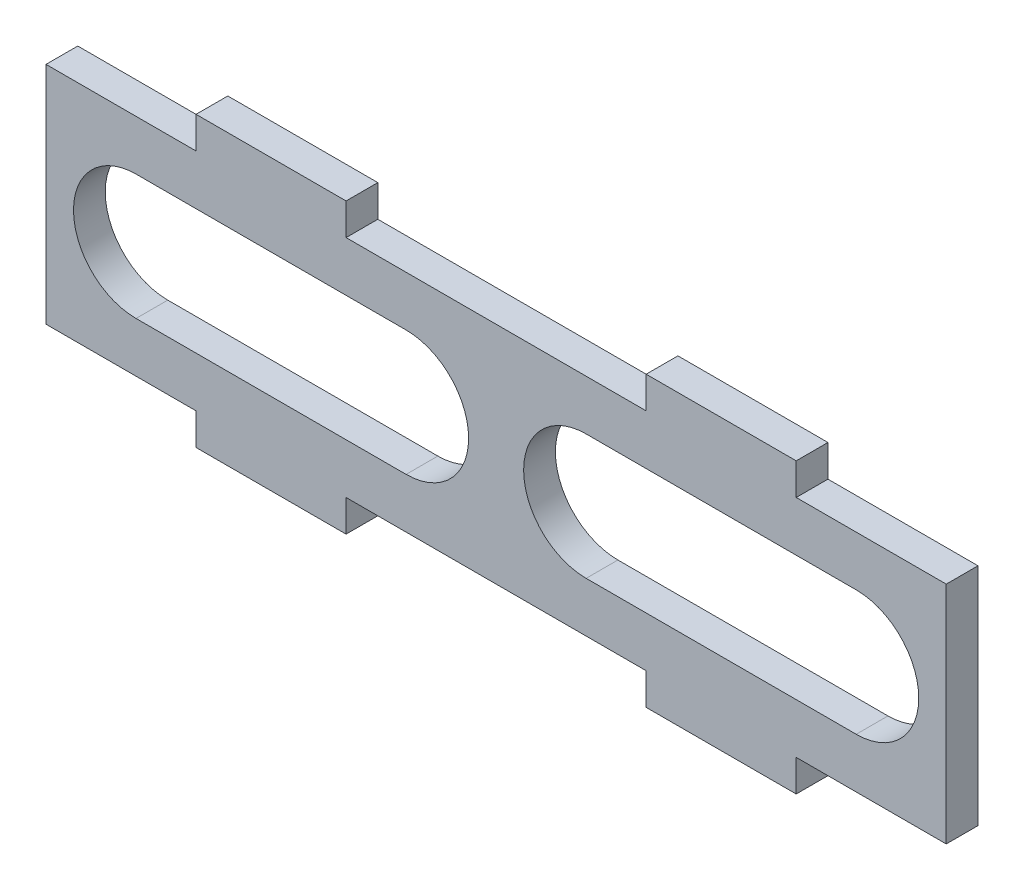
ISO-10303-21;
HEADER;
FILE_DESCRIPTION(('STEP AP214'),'2;1');
FILE_NAME('part.step','',(''),(''),'','','');
FILE_SCHEMA(('AUTOMOTIVE_DESIGN { 1 0 10303 214 1 1 1 1 }'));
ENDSEC;
DATA;
#1=APPLICATION_CONTEXT('core data for automotive mechanical design processes');
#2=APPLICATION_PROTOCOL_DEFINITION('international standard','automotive_design',2000,#1);
#3=PRODUCT_CONTEXT('',#1,'mechanical');
#4=PRODUCT('Part','Part','',(#3));
#5=PRODUCT_RELATED_PRODUCT_CATEGORY('part','',(#4));
#6=PRODUCT_DEFINITION_FORMATION('','',#4);
#7=PRODUCT_DEFINITION_CONTEXT('part definition',#1,'design');
#8=PRODUCT_DEFINITION('design','',#6,#7);
#9=PRODUCT_DEFINITION_SHAPE('','',#8);
#10=(LENGTH_UNIT() NAMED_UNIT(*) SI_UNIT(.MILLI.,.METRE.));
#11=(NAMED_UNIT(*) PLANE_ANGLE_UNIT() SI_UNIT($,.RADIAN.));
#12=(NAMED_UNIT(*) SI_UNIT($,.STERADIAN.) SOLID_ANGLE_UNIT());
#13=UNCERTAINTY_MEASURE_WITH_UNIT(LENGTH_MEASURE(1.E-05),#10,'distance_accuracy_value','');
#14=(GEOMETRIC_REPRESENTATION_CONTEXT(3) GLOBAL_UNCERTAINTY_ASSIGNED_CONTEXT((#13)) GLOBAL_UNIT_ASSIGNED_CONTEXT((#10,
#11,#12)) REPRESENTATION_CONTEXT('',''));
#15=CARTESIAN_POINT('',(0.,0.,0.));
#16=DIRECTION('',(0.,0.,1.));
#17=DIRECTION('',(1.,0.,0.));
#18=AXIS2_PLACEMENT_3D('',#15,#16,#17);
#19=CARTESIAN_POINT('',(-90.,45.,6.35));
#20=DIRECTION('',(0.,-1.,0.));
#21=DIRECTION('',(0.,0.,-1.));
#22=AXIS2_PLACEMENT_3D('',#19,#20,#21);
#23=PLANE('',#22);
#24=DIRECTION('',(-1.,0.,0.));
#25=VECTOR('',#24,1.);
#26=CARTESIAN_POINT('',(-90.,45.,6.35));
#27=LINE('',#26,#25);
#28=CARTESIAN_POINT('',(29.9999999999999,45.,6.35));
#29=VERTEX_POINT('',#28);
#30=CARTESIAN_POINT('',(-30.,45.,6.35));
#31=VERTEX_POINT('',#30);
#32=EDGE_CURVE('E48',#29,#31,#27,.T.);
#33=ORIENTED_EDGE('',*,*,#32,.F.);
#34=DIRECTION('',(0.,0.,1.));
#35=VECTOR('',#34,1.);
#36=CARTESIAN_POINT('',(29.9999999999999,45.,-30.6646783775731));
#37=LINE('',#36,#35);
#38=CARTESIAN_POINT('',(29.9999999999999,45.,0.));
#39=VERTEX_POINT('',#38);
#40=EDGE_CURVE('E230',#39,#29,#37,.T.);
#41=ORIENTED_EDGE('',*,*,#40,.F.);
#42=DIRECTION('',(-1.,0.,0.));
#43=VECTOR('',#42,1.);
#44=CARTESIAN_POINT('',(-90.,45.,0.));
#45=LINE('',#44,#43);
#46=CARTESIAN_POINT('',(-30.,45.,0.));
#47=VERTEX_POINT('',#46);
#48=EDGE_CURVE('E228',#39,#47,#45,.T.);
#49=ORIENTED_EDGE('',*,*,#48,.T.);
#50=DIRECTION('',(0.,0.,1.));
#51=VECTOR('',#50,1.);
#52=CARTESIAN_POINT('',(-30.,45.,-30.6646783775731));
#53=LINE('',#52,#51);
#54=EDGE_CURVE('E313',#47,#31,#53,.T.);
#55=ORIENTED_EDGE('',*,*,#54,.T.);
#56=EDGE_LOOP('',(#33,#41,#49,#55));
#57=FACE_BOUND('',#56,.T.);
#58=ADVANCED_FACE('F33',(#57),#23,.F.);
#59=CARTESIAN_POINT('',(-90.,0.,6.35));
#60=DIRECTION('',(0.,1.,0.));
#61=DIRECTION('',(0.,0.,1.));
#62=AXIS2_PLACEMENT_3D('',#59,#60,#61);
#63=PLANE('',#62);
#64=DIRECTION('',(1.,0.,0.));
#65=VECTOR('',#64,1.);
#66=CARTESIAN_POINT('',(-90.,0.,0.));
#67=LINE('',#66,#65);
#68=CARTESIAN_POINT('',(-30.,0.,0.));
#69=VERTEX_POINT('',#68);
#70=CARTESIAN_POINT('',(29.9999999999999,0.,0.));
#71=VERTEX_POINT('',#70);
#72=EDGE_CURVE('E421',#69,#71,#67,.T.);
#73=ORIENTED_EDGE('',*,*,#72,.T.);
#74=DIRECTION('',(0.,0.,1.));
#75=VECTOR('',#74,1.);
#76=CARTESIAN_POINT('',(30.,0.,-30.6646783775731));
#77=LINE('',#76,#75);
#78=CARTESIAN_POINT('',(29.9999999999999,0.,6.35));
#79=VERTEX_POINT('',#78);
#80=EDGE_CURVE('E279',#71,#79,#77,.T.);
#81=ORIENTED_EDGE('',*,*,#80,.T.);
#82=DIRECTION('',(1.,0.,0.));
#83=VECTOR('',#82,1.);
#84=CARTESIAN_POINT('',(-90.,0.,6.35));
#85=LINE('',#84,#83);
#86=CARTESIAN_POINT('',(-30.,0.,6.35));
#87=VERTEX_POINT('',#86);
#88=EDGE_CURVE('E408',#87,#79,#85,.T.);
#89=ORIENTED_EDGE('',*,*,#88,.F.);
#90=DIRECTION('',(0.,0.,1.));
#91=VECTOR('',#90,1.);
#92=CARTESIAN_POINT('',(-30.,0.,-30.6646783775731));
#93=LINE('',#92,#91);
#94=EDGE_CURVE('E303',#69,#87,#93,.T.);
#95=ORIENTED_EDGE('',*,*,#94,.F.);
#96=EDGE_LOOP('',(#73,#81,#89,#95));
#97=FACE_BOUND('',#96,.T.);
#98=ADVANCED_FACE('F483',(#97),#63,.F.);
#99=CARTESIAN_POINT('',(59.9999999999999,0.,6.35));
#100=VERTEX_POINT('',#99);
#101=CARTESIAN_POINT('',(90.,0.,6.35));
#102=VERTEX_POINT('',#101);
#103=EDGE_CURVE('E402',#100,#102,#85,.T.);
#104=ORIENTED_EDGE('',*,*,#103,.F.);
#105=DIRECTION('',(0.,0.,1.));
#106=VECTOR('',#105,1.);
#107=CARTESIAN_POINT('',(60.,0.,-30.6646783775731));
#108=LINE('',#107,#106);
#109=CARTESIAN_POINT('',(60.,0.,0.));
#110=VERTEX_POINT('',#109);
#111=EDGE_CURVE('E272',#110,#100,#108,.T.);
#112=ORIENTED_EDGE('',*,*,#111,.F.);
#113=CARTESIAN_POINT('',(90.,0.,0.));
#114=VERTEX_POINT('',#113);
#115=EDGE_CURVE('E416',#110,#114,#67,.T.);
#116=ORIENTED_EDGE('',*,*,#115,.T.);
#117=DIRECTION('',(0.,0.,-1.));
#118=VECTOR('',#117,1.);
#119=CARTESIAN_POINT('',(90.,0.,6.35));
#120=LINE('',#119,#118);
#121=EDGE_CURVE('E41',#102,#114,#120,.T.);
#122=ORIENTED_EDGE('',*,*,#121,.F.);
#123=EDGE_LOOP('',(#104,#112,#116,#122));
#124=FACE_BOUND('',#123,.T.);
#125=ADVANCED_FACE('F487',(#124),#63,.F.);
#126=DIRECTION('',(0.,0.,1.));
#127=VECTOR('',#126,1.);
#128=CARTESIAN_POINT('',(-60.,45.,-30.6646783775731));
#129=LINE('',#128,#127);
#130=CARTESIAN_POINT('',(-60.,45.,0.));
#131=VERTEX_POINT('',#130);
#132=CARTESIAN_POINT('',(-60.,45.,6.35));
#133=VERTEX_POINT('',#132);
#134=EDGE_CURVE('E321',#131,#133,#129,.T.);
#135=ORIENTED_EDGE('',*,*,#134,.F.);
#136=CARTESIAN_POINT('',(-90.,45.,0.));
#137=VERTEX_POINT('',#136);
#138=EDGE_CURVE('E423',#131,#137,#45,.T.);
#139=ORIENTED_EDGE('',*,*,#138,.T.);
#140=DIRECTION('',(0.,0.,-1.));
#141=VECTOR('',#140,1.);
#142=CARTESIAN_POINT('',(-90.,45.,6.35));
#143=LINE('',#142,#141);
#144=CARTESIAN_POINT('',(-90.,45.,6.35));
#145=VERTEX_POINT('',#144);
#146=EDGE_CURVE('E413',#145,#137,#143,.T.);
#147=ORIENTED_EDGE('',*,*,#146,.F.);
#148=EDGE_CURVE('E410',#133,#145,#27,.T.);
#149=ORIENTED_EDGE('',*,*,#148,.F.);
#150=EDGE_LOOP('',(#135,#139,#147,#149));
#151=FACE_BOUND('',#150,.T.);
#152=ADVANCED_FACE('F462',(#151),#23,.F.);
#153=CARTESIAN_POINT('',(-90.,0.,6.35));
#154=DIRECTION('',(1.,0.,0.));
#155=DIRECTION('',(0.,0.,-1.));
#156=AXIS2_PLACEMENT_3D('',#153,#154,#155);
#157=PLANE('',#156);
#158=DIRECTION('',(0.,-1.,0.));
#159=VECTOR('',#158,1.);
#160=CARTESIAN_POINT('',(-90.,0.,0.));
#161=LINE('',#160,#159);
#162=CARTESIAN_POINT('',(-90.,0.,0.));
#163=VERTEX_POINT('',#162);
#164=EDGE_CURVE('E368',#137,#163,#161,.T.);
#165=ORIENTED_EDGE('',*,*,#164,.T.);
#166=DIRECTION('',(0.,0.,-1.));
#167=VECTOR('',#166,1.);
#168=CARTESIAN_POINT('',(-90.,0.,6.35));
#169=LINE('',#168,#167);
#170=CARTESIAN_POINT('',(-90.,0.,6.35));
#171=VERTEX_POINT('',#170);
#172=EDGE_CURVE('E11',#171,#163,#169,.T.);
#173=ORIENTED_EDGE('',*,*,#172,.F.);
#174=DIRECTION('',(0.,-1.,0.));
#175=VECTOR('',#174,1.);
#176=CARTESIAN_POINT('',(-90.,0.,6.35));
#177=LINE('',#176,#175);
#178=EDGE_CURVE('E399',#145,#171,#177,.T.);
#179=ORIENTED_EDGE('',*,*,#178,.F.);
#180=ORIENTED_EDGE('',*,*,#146,.T.);
#181=EDGE_LOOP('',(#165,#173,#179,#180));
#182=FACE_BOUND('',#181,.T.);
#183=ADVANCED_FACE('F35',(#182),#157,.F.);
#184=CARTESIAN_POINT('',(-60.,0.,0.));
#185=VERTEX_POINT('',#184);
#186=EDGE_CURVE('E417',#163,#185,#67,.T.);
#187=ORIENTED_EDGE('',*,*,#186,.T.);
#188=DIRECTION('',(0.,0.,1.));
#189=VECTOR('',#188,1.);
#190=CARTESIAN_POINT('',(-60.,0.,-30.6646783775731));
#191=LINE('',#190,#189);
#192=CARTESIAN_POINT('',(-60.,0.,6.35));
#193=VERTEX_POINT('',#192);
#194=EDGE_CURVE('E300',#185,#193,#191,.T.);
#195=ORIENTED_EDGE('',*,*,#194,.T.);
#196=EDGE_CURVE('E404',#171,#193,#85,.T.);
#197=ORIENTED_EDGE('',*,*,#196,.F.);
#198=ORIENTED_EDGE('',*,*,#172,.T.);
#199=EDGE_LOOP('',(#187,#195,#197,#198));
#200=FACE_BOUND('',#199,.T.);
#201=ADVANCED_FACE('F467',(#200),#63,.F.);
#202=CARTESIAN_POINT('',(90.,0.,6.35));
#203=DIRECTION('',(-1.,0.,0.));
#204=DIRECTION('',(0.,0.,1.));
#205=AXIS2_PLACEMENT_3D('',#202,#203,#204);
#206=PLANE('',#205);
#207=DIRECTION('',(0.,1.,0.));
#208=VECTOR('',#207,1.);
#209=CARTESIAN_POINT('',(90.,0.,0.));
#210=LINE('',#209,#208);
#211=CARTESIAN_POINT('',(90.,45.,0.));
#212=VERTEX_POINT('',#211);
#213=EDGE_CURVE('E420',#114,#212,#210,.T.);
#214=ORIENTED_EDGE('',*,*,#213,.T.);
#215=DIRECTION('',(0.,0.,-1.));
#216=VECTOR('',#215,1.);
#217=CARTESIAN_POINT('',(90.,45.,6.35));
#218=LINE('',#217,#216);
#219=CARTESIAN_POINT('',(90.,45.,6.35));
#220=VERTEX_POINT('',#219);
#221=EDGE_CURVE('E427',#220,#212,#218,.T.);
#222=ORIENTED_EDGE('',*,*,#221,.F.);
#223=DIRECTION('',(0.,1.,0.));
#224=VECTOR('',#223,1.);
#225=CARTESIAN_POINT('',(90.,0.,6.35));
#226=LINE('',#225,#224);
#227=EDGE_CURVE('E407',#102,#220,#226,.T.);
#228=ORIENTED_EDGE('',*,*,#227,.F.);
#229=ORIENTED_EDGE('',*,*,#121,.T.);
#230=EDGE_LOOP('',(#214,#222,#228,#229));
#231=FACE_BOUND('',#230,.T.);
#232=ADVANCED_FACE('F434',(#231),#206,.F.);
#233=CARTESIAN_POINT('',(59.9999999999999,45.,0.));
#234=VERTEX_POINT('',#233);
#235=EDGE_CURVE('E403',#212,#234,#45,.T.);
#236=ORIENTED_EDGE('',*,*,#235,.T.);
#237=DIRECTION('',(0.,0.,1.));
#238=VECTOR('',#237,1.);
#239=CARTESIAN_POINT('',(59.9999999999999,45.,-30.6646783775731));
#240=LINE('',#239,#238);
#241=CARTESIAN_POINT('',(59.9999999999999,45.,6.35));
#242=VERTEX_POINT('',#241);
#243=EDGE_CURVE('E56',#234,#242,#240,.T.);
#244=ORIENTED_EDGE('',*,*,#243,.T.);
#245=EDGE_CURVE('E411',#220,#242,#27,.T.);
#246=ORIENTED_EDGE('',*,*,#245,.F.);
#247=ORIENTED_EDGE('',*,*,#221,.T.);
#248=EDGE_LOOP('',(#236,#244,#246,#247));
#249=FACE_BOUND('',#248,.T.);
#250=ADVANCED_FACE('F439',(#249),#23,.F.);
#251=CARTESIAN_POINT('',(0.,0.,6.35));
#252=DIRECTION('',(0.,0.,-1.));
#253=DIRECTION('',(-1.,0.,0.));
#254=AXIS2_PLACEMENT_3D('',#251,#252,#253);
#255=PLANE('',#254);
#256=DIRECTION('',(1.,0.,0.));
#257=VECTOR('',#256,1.);
#258=CARTESIAN_POINT('',(-72.,9.99999999999999,6.35));
#259=LINE('',#258,#257);
#260=CARTESIAN_POINT('',(-72.,9.99999999999999,6.35));
#261=VERTEX_POINT('',#260);
#262=CARTESIAN_POINT('',(-18.,10.,6.35));
#263=VERTEX_POINT('',#262);
#264=EDGE_CURVE('E347',#261,#263,#259,.T.);
#265=ORIENTED_EDGE('',*,*,#264,.F.);
#266=CARTESIAN_POINT('',(-72.,22.5,6.35));
#267=DIRECTION('',(0.,0.,1.));
#268=DIRECTION('',(1.,0.,0.));
#269=AXIS2_PLACEMENT_3D('',#266,#267,#268);
#270=CIRCLE('',#269,12.5);
#271=CARTESIAN_POINT('',(-72.,35.,6.35));
#272=VERTEX_POINT('',#271);
#273=EDGE_CURVE('E345',#272,#261,#270,.T.);
#274=ORIENTED_EDGE('',*,*,#273,.F.);
#275=DIRECTION('',(-1.,0.,0.));
#276=VECTOR('',#275,1.);
#277=CARTESIAN_POINT('',(-72.,35.,6.35));
#278=LINE('',#277,#276);
#279=CARTESIAN_POINT('',(-18.,35.,6.35));
#280=VERTEX_POINT('',#279);
#281=EDGE_CURVE('E353',#280,#272,#278,.T.);
#282=ORIENTED_EDGE('',*,*,#281,.F.);
#283=CARTESIAN_POINT('',(-18.,22.5,6.35));
#284=DIRECTION('',(0.,0.,1.));
#285=DIRECTION('',(1.,0.,0.));
#286=AXIS2_PLACEMENT_3D('',#283,#284,#285);
#287=CIRCLE('',#286,12.5);
#288=EDGE_CURVE('E350',#263,#280,#287,.T.);
#289=ORIENTED_EDGE('',*,*,#288,.F.);
#290=EDGE_LOOP('',(#265,#274,#282,#289));
#291=FACE_BOUND('',#290,.T.);
#292=DIRECTION('',(-1.,0.,0.));
#293=VECTOR('',#292,1.);
#294=CARTESIAN_POINT('',(72.,35.,6.35));
#295=LINE('',#294,#293);
#296=CARTESIAN_POINT('',(72.,35.,6.35));
#297=VERTEX_POINT('',#296);
#298=CARTESIAN_POINT('',(18.,35.,6.35));
#299=VERTEX_POINT('',#298);
#300=EDGE_CURVE('E379',#297,#299,#295,.T.);
#301=ORIENTED_EDGE('',*,*,#300,.F.);
#302=CARTESIAN_POINT('',(72.,22.5,6.35));
#303=DIRECTION('',(0.,0.,1.));
#304=DIRECTION('',(-1.,0.,0.));
#305=AXIS2_PLACEMENT_3D('',#302,#303,#304);
#306=CIRCLE('',#305,12.5);
#307=CARTESIAN_POINT('',(72.,10.,6.35));
#308=VERTEX_POINT('',#307);
#309=EDGE_CURVE('E377',#308,#297,#306,.T.);
#310=ORIENTED_EDGE('',*,*,#309,.F.);
#311=DIRECTION('',(1.,0.,0.));
#312=VECTOR('',#311,1.);
#313=CARTESIAN_POINT('',(72.,10.,6.35));
#314=LINE('',#313,#312);
#315=CARTESIAN_POINT('',(18.,10.,6.35));
#316=VERTEX_POINT('',#315);
#317=EDGE_CURVE('E385',#316,#308,#314,.T.);
#318=ORIENTED_EDGE('',*,*,#317,.F.);
#319=CARTESIAN_POINT('',(18.,22.5,6.35));
#320=DIRECTION('',(0.,0.,1.));
#321=DIRECTION('',(-1.,0.,0.));
#322=AXIS2_PLACEMENT_3D('',#319,#320,#321);
#323=CIRCLE('',#322,12.5);
#324=EDGE_CURVE('E382',#299,#316,#323,.T.);
#325=ORIENTED_EDGE('',*,*,#324,.F.);
#326=EDGE_LOOP('',(#301,#310,#318,#325));
#327=FACE_BOUND('',#326,.T.);
#328=ORIENTED_EDGE('',*,*,#178,.T.);
#329=ORIENTED_EDGE('',*,*,#196,.T.);
#330=DIRECTION('',(0.,-1.,0.));
#331=VECTOR('',#330,1.);
#332=CARTESIAN_POINT('',(-60.,0.,6.35));
#333=LINE('',#332,#331);
#334=CARTESIAN_POINT('',(-60.,-6.34999999999999,6.35));
#335=VERTEX_POINT('',#334);
#336=EDGE_CURVE('E283',#193,#335,#333,.T.);
#337=ORIENTED_EDGE('',*,*,#336,.T.);
#338=DIRECTION('',(1.,0.,0.));
#339=VECTOR('',#338,1.);
#340=CARTESIAN_POINT('',(-60.,-6.34999999999999,6.35));
#341=LINE('',#340,#339);
#342=CARTESIAN_POINT('',(-30.,-6.34999999999999,6.35));
#343=VERTEX_POINT('',#342);
#344=EDGE_CURVE('E288',#335,#343,#341,.T.);
#345=ORIENTED_EDGE('',*,*,#344,.T.);
#346=DIRECTION('',(0.,1.,0.));
#347=VECTOR('',#346,1.);
#348=CARTESIAN_POINT('',(-30.,0.,6.35));
#349=LINE('',#348,#347);
#350=EDGE_CURVE('E284',#343,#87,#349,.T.);
#351=ORIENTED_EDGE('',*,*,#350,.T.);
#352=ORIENTED_EDGE('',*,*,#88,.T.);
#353=DIRECTION('',(0.,-1.,0.));
#354=VECTOR('',#353,1.);
#355=CARTESIAN_POINT('',(30.,0.,6.35));
#356=LINE('',#355,#354);
#357=CARTESIAN_POINT('',(30.,-6.34999999999999,6.35));
#358=VERTEX_POINT('',#357);
#359=EDGE_CURVE('E256',#79,#358,#356,.T.);
#360=ORIENTED_EDGE('',*,*,#359,.T.);
#361=DIRECTION('',(1.,0.,0.));
#362=VECTOR('',#361,1.);
#363=CARTESIAN_POINT('',(60.,-6.34999999999998,6.35));
#364=LINE('',#363,#362);
#365=CARTESIAN_POINT('',(60.,-6.34999999999998,6.35));
#366=VERTEX_POINT('',#365);
#367=EDGE_CURVE('E261',#358,#366,#364,.T.);
#368=ORIENTED_EDGE('',*,*,#367,.T.);
#369=DIRECTION('',(0.,1.,0.));
#370=VECTOR('',#369,1.);
#371=CARTESIAN_POINT('',(60.,0.,6.35));
#372=LINE('',#371,#370);
#373=EDGE_CURVE('E257',#366,#100,#372,.T.);
#374=ORIENTED_EDGE('',*,*,#373,.T.);
#375=ORIENTED_EDGE('',*,*,#103,.T.);
#376=ORIENTED_EDGE('',*,*,#227,.T.);
#377=ORIENTED_EDGE('',*,*,#245,.T.);
#378=DIRECTION('',(0.,1.,0.));
#379=VECTOR('',#378,1.);
#380=CARTESIAN_POINT('',(59.9999999999999,45.,6.35));
#381=LINE('',#380,#379);
#382=CARTESIAN_POINT('',(59.9999999999999,51.35,6.35));
#383=VERTEX_POINT('',#382);
#384=EDGE_CURVE('E249',#242,#383,#381,.T.);
#385=ORIENTED_EDGE('',*,*,#384,.T.);
#386=DIRECTION('',(-1.,0.,0.));
#387=VECTOR('',#386,1.);
#388=CARTESIAN_POINT('',(59.9999999999999,51.35,6.35));
#389=LINE('',#388,#387);
#390=CARTESIAN_POINT('',(29.9999999999999,51.35,6.35));
#391=VERTEX_POINT('',#390);
#392=EDGE_CURVE('E245',#383,#391,#389,.T.);
#393=ORIENTED_EDGE('',*,*,#392,.T.);
#394=DIRECTION('',(0.,-1.,0.));
#395=VECTOR('',#394,1.);
#396=CARTESIAN_POINT('',(29.9999999999999,45.,6.35));
#397=LINE('',#396,#395);
#398=EDGE_CURVE('E236',#391,#29,#397,.T.);
#399=ORIENTED_EDGE('',*,*,#398,.T.);
#400=ORIENTED_EDGE('',*,*,#32,.T.);
#401=DIRECTION('',(0.,1.,0.));
#402=VECTOR('',#401,1.);
#403=CARTESIAN_POINT('',(-30.,45.,6.35));
#404=LINE('',#403,#402);
#405=CARTESIAN_POINT('',(-30.,51.35,6.35));
#406=VERTEX_POINT('',#405);
#407=EDGE_CURVE('E314',#31,#406,#404,.T.);
#408=ORIENTED_EDGE('',*,*,#407,.T.);
#409=DIRECTION('',(-1.,0.,0.));
#410=VECTOR('',#409,1.);
#411=CARTESIAN_POINT('',(-60.,51.35,6.35));
#412=LINE('',#411,#410);
#413=CARTESIAN_POINT('',(-60.,51.35,6.35));
#414=VERTEX_POINT('',#413);
#415=EDGE_CURVE('E310',#406,#414,#412,.T.);
#416=ORIENTED_EDGE('',*,*,#415,.T.);
#417=DIRECTION('',(0.,-1.,0.));
#418=VECTOR('',#417,1.);
#419=CARTESIAN_POINT('',(-60.,45.,6.35));
#420=LINE('',#419,#418);
#421=EDGE_CURVE('E309',#414,#133,#420,.T.);
#422=ORIENTED_EDGE('',*,*,#421,.T.);
#423=ORIENTED_EDGE('',*,*,#148,.T.);
#424=EDGE_LOOP('',(#328,#329,#337,#345,#351,#352,#360,#368,#374,#375,#376,#377,#385,#393,#399,
#400,#408,#416,#422,#423));
#425=FACE_BOUND('',#424,.T.);
#426=ADVANCED_FACE('F443',(#291,#327,#425),#255,.F.);
#427=CARTESIAN_POINT('',(0.,0.,0.));
#428=DIRECTION('',(0.,0.,-1.));
#429=DIRECTION('',(-1.,0.,0.));
#430=AXIS2_PLACEMENT_3D('',#427,#428,#429);
#431=PLANE('',#430);
#432=CARTESIAN_POINT('',(-72.,22.5,0.));
#433=DIRECTION('',(0.,0.,-1.));
#434=DIRECTION('',(-1.,0.,0.));
#435=AXIS2_PLACEMENT_3D('',#432,#433,#434);
#436=CIRCLE('',#435,12.5);
#437=CARTESIAN_POINT('',(-72.,35.,0.));
#438=VERTEX_POINT('',#437);
#439=CARTESIAN_POINT('',(-72.,9.99999999999999,0.));
#440=VERTEX_POINT('',#439);
#441=EDGE_CURVE('E342',#438,#440,#436,.F.);
#442=ORIENTED_EDGE('',*,*,#441,.T.);
#443=DIRECTION('',(1.,0.,0.));
#444=VECTOR('',#443,1.);
#445=CARTESIAN_POINT('',(-72.,9.99999999999999,0.));
#446=LINE('',#445,#444);
#447=CARTESIAN_POINT('',(-18.,10.,0.));
#448=VERTEX_POINT('',#447);
#449=EDGE_CURVE('E359',#440,#448,#446,.T.);
#450=ORIENTED_EDGE('',*,*,#449,.T.);
#451=CARTESIAN_POINT('',(-18.,22.5,0.));
#452=DIRECTION('',(0.,0.,-1.));
#453=DIRECTION('',(-1.,0.,0.));
#454=AXIS2_PLACEMENT_3D('',#451,#452,#453);
#455=CIRCLE('',#454,12.5);
#456=CARTESIAN_POINT('',(-18.,35.,0.));
#457=VERTEX_POINT('',#456);
#458=EDGE_CURVE('E335',#448,#457,#455,.F.);
#459=ORIENTED_EDGE('',*,*,#458,.T.);
#460=DIRECTION('',(-1.,0.,0.));
#461=VECTOR('',#460,1.);
#462=CARTESIAN_POINT('',(-72.,35.,0.));
#463=LINE('',#462,#461);
#464=EDGE_CURVE('E338',#457,#438,#463,.T.);
#465=ORIENTED_EDGE('',*,*,#464,.T.);
#466=EDGE_LOOP('',(#442,#450,#459,#465));
#467=FACE_BOUND('',#466,.T.);
#468=CARTESIAN_POINT('',(72.,22.5,0.));
#469=DIRECTION('',(0.,0.,-1.));
#470=DIRECTION('',(-1.,0.,0.));
#471=AXIS2_PLACEMENT_3D('',#468,#469,#470);
#472=CIRCLE('',#471,12.5);
#473=CARTESIAN_POINT('',(72.,10.,0.));
#474=VERTEX_POINT('',#473);
#475=CARTESIAN_POINT('',(72.,35.,0.));
#476=VERTEX_POINT('',#475);
#477=EDGE_CURVE('E374',#474,#476,#472,.F.);
#478=ORIENTED_EDGE('',*,*,#477,.T.);
#479=DIRECTION('',(-1.,0.,0.));
#480=VECTOR('',#479,1.);
#481=CARTESIAN_POINT('',(72.,35.,0.));
#482=LINE('',#481,#480);
#483=CARTESIAN_POINT('',(18.,35.,0.));
#484=VERTEX_POINT('',#483);
#485=EDGE_CURVE('E339',#476,#484,#482,.T.);
#486=ORIENTED_EDGE('',*,*,#485,.T.);
#487=CARTESIAN_POINT('',(18.,22.5,0.));
#488=DIRECTION('',(0.,0.,-1.));
#489=DIRECTION('',(-1.,0.,0.));
#490=AXIS2_PLACEMENT_3D('',#487,#488,#489);
#491=CIRCLE('',#490,12.5);
#492=CARTESIAN_POINT('',(18.,10.,0.));
#493=VERTEX_POINT('',#492);
#494=EDGE_CURVE('E334',#484,#493,#491,.F.);
#495=ORIENTED_EDGE('',*,*,#494,.T.);
#496=DIRECTION('',(1.,0.,0.));
#497=VECTOR('',#496,1.);
#498=CARTESIAN_POINT('',(72.,10.,0.));
#499=LINE('',#498,#497);
#500=EDGE_CURVE('E371',#493,#474,#499,.T.);
#501=ORIENTED_EDGE('',*,*,#500,.T.);
#502=EDGE_LOOP('',(#478,#486,#495,#501));
#503=FACE_BOUND('',#502,.T.);
#504=ORIENTED_EDGE('',*,*,#164,.F.);
#505=ORIENTED_EDGE('',*,*,#138,.F.);
#506=DIRECTION('',(0.,-1.,0.));
#507=VECTOR('',#506,1.);
#508=CARTESIAN_POINT('',(-60.,45.,0.));
#509=LINE('',#508,#507);
#510=CARTESIAN_POINT('',(-60.,51.35,0.));
#511=VERTEX_POINT('',#510);
#512=EDGE_CURVE('E319',#511,#131,#509,.T.);
#513=ORIENTED_EDGE('',*,*,#512,.F.);
#514=DIRECTION('',(-1.,0.,0.));
#515=VECTOR('',#514,1.);
#516=CARTESIAN_POINT('',(-60.,51.35,0.));
#517=LINE('',#516,#515);
#518=CARTESIAN_POINT('',(-30.,51.35,0.));
#519=VERTEX_POINT('',#518);
#520=EDGE_CURVE('E323',#519,#511,#517,.T.);
#521=ORIENTED_EDGE('',*,*,#520,.F.);
#522=DIRECTION('',(0.,1.,0.));
#523=VECTOR('',#522,1.);
#524=CARTESIAN_POINT('',(-30.,45.,0.));
#525=LINE('',#524,#523);
#526=EDGE_CURVE('E327',#47,#519,#525,.T.);
#527=ORIENTED_EDGE('',*,*,#526,.F.);
#528=ORIENTED_EDGE('',*,*,#48,.F.);
#529=DIRECTION('',(0.,-1.,0.));
#530=VECTOR('',#529,1.);
#531=CARTESIAN_POINT('',(29.9999999999999,45.,0.));
#532=LINE('',#531,#530);
#533=CARTESIAN_POINT('',(29.9999999999999,51.35,0.));
#534=VERTEX_POINT('',#533);
#535=EDGE_CURVE('E219',#534,#39,#532,.T.);
#536=ORIENTED_EDGE('',*,*,#535,.F.);
#537=DIRECTION('',(-1.,0.,0.));
#538=VECTOR('',#537,1.);
#539=CARTESIAN_POINT('',(59.9999999999999,51.35,0.));
#540=LINE('',#539,#538);
#541=CARTESIAN_POINT('',(59.9999999999999,51.35,0.));
#542=VERTEX_POINT('',#541);
#543=EDGE_CURVE('E225',#542,#534,#540,.T.);
#544=ORIENTED_EDGE('',*,*,#543,.F.);
#545=DIRECTION('',(0.,1.,0.));
#546=VECTOR('',#545,1.);
#547=CARTESIAN_POINT('',(59.9999999999999,45.,0.));
#548=LINE('',#547,#546);
#549=EDGE_CURVE('E251',#234,#542,#548,.T.);
#550=ORIENTED_EDGE('',*,*,#549,.F.);
#551=ORIENTED_EDGE('',*,*,#235,.F.);
#552=ORIENTED_EDGE('',*,*,#213,.F.);
#553=ORIENTED_EDGE('',*,*,#115,.F.);
#554=DIRECTION('',(0.,1.,0.));
#555=VECTOR('',#554,1.);
#556=CARTESIAN_POINT('',(60.,0.,0.));
#557=LINE('',#556,#555);
#558=CARTESIAN_POINT('',(60.,-6.34999999999998,0.));
#559=VERTEX_POINT('',#558);
#560=EDGE_CURVE('E269',#559,#110,#557,.T.);
#561=ORIENTED_EDGE('',*,*,#560,.F.);
#562=DIRECTION('',(1.,0.,0.));
#563=VECTOR('',#562,1.);
#564=CARTESIAN_POINT('',(60.,-6.34999999999998,0.));
#565=LINE('',#564,#563);
#566=CARTESIAN_POINT('',(30.,-6.34999999999999,0.));
#567=VERTEX_POINT('',#566);
#568=EDGE_CURVE('E274',#567,#559,#565,.T.);
#569=ORIENTED_EDGE('',*,*,#568,.F.);
#570=DIRECTION('',(0.,-1.,0.));
#571=VECTOR('',#570,1.);
#572=CARTESIAN_POINT('',(30.,0.,0.));
#573=LINE('',#572,#571);
#574=EDGE_CURVE('E260',#71,#567,#573,.T.);
#575=ORIENTED_EDGE('',*,*,#574,.F.);
#576=ORIENTED_EDGE('',*,*,#72,.F.);
#577=DIRECTION('',(0.,1.,0.));
#578=VECTOR('',#577,1.);
#579=CARTESIAN_POINT('',(-30.,0.,0.));
#580=LINE('',#579,#578);
#581=CARTESIAN_POINT('',(-30.,-6.34999999999999,0.));
#582=VERTEX_POINT('',#581);
#583=EDGE_CURVE('E301',#582,#69,#580,.T.);
#584=ORIENTED_EDGE('',*,*,#583,.F.);
#585=DIRECTION('',(1.,0.,0.));
#586=VECTOR('',#585,1.);
#587=CARTESIAN_POINT('',(-60.,-6.34999999999999,0.));
#588=LINE('',#587,#586);
#589=CARTESIAN_POINT('',(-60.,-6.34999999999999,0.));
#590=VERTEX_POINT('',#589);
#591=EDGE_CURVE('E287',#590,#582,#588,.T.);
#592=ORIENTED_EDGE('',*,*,#591,.F.);
#593=DIRECTION('',(0.,-1.,0.));
#594=VECTOR('',#593,1.);
#595=CARTESIAN_POINT('',(-60.,0.,0.));
#596=LINE('',#595,#594);
#597=EDGE_CURVE('E296',#185,#590,#596,.T.);
#598=ORIENTED_EDGE('',*,*,#597,.F.);
#599=ORIENTED_EDGE('',*,*,#186,.F.);
#600=EDGE_LOOP('',(#504,#505,#513,#521,#527,#528,#536,#544,#550,#551,#552,#553,#561,#569,#575,
#576,#584,#592,#598,#599));
#601=FACE_BOUND('',#600,.T.);
#602=ADVANCED_FACE('F222',(#467,#503,#601),#431,.T.);
#603=CARTESIAN_POINT('',(72.,22.5,-0.00100000000000013));
#604=DIRECTION('',(0.,0.,1.));
#605=DIRECTION('',(1.,0.,0.));
#606=AXIS2_PLACEMENT_3D('',#603,#604,#605);
#607=CYLINDRICAL_SURFACE('',#606,12.5);
#608=DIRECTION('',(0.,0.,1.));
#609=VECTOR('',#608,1.);
#610=CARTESIAN_POINT('',(72.,10.,-0.00100000000000013));
#611=LINE('',#610,#609);
#612=EDGE_CURVE('E389',#474,#308,#611,.T.);
#613=ORIENTED_EDGE('',*,*,#612,.T.);
#614=ORIENTED_EDGE('',*,*,#309,.T.);
#615=DIRECTION('',(0.,0.,1.));
#616=VECTOR('',#615,1.);
#617=CARTESIAN_POINT('',(72.,35.,-0.00100000000000013));
#618=LINE('',#617,#616);
#619=EDGE_CURVE('E388',#476,#297,#618,.T.);
#620=ORIENTED_EDGE('',*,*,#619,.F.);
#621=ORIENTED_EDGE('',*,*,#477,.F.);
#622=EDGE_LOOP('',(#613,#614,#620,#621));
#623=FACE_BOUND('',#622,.T.);
#624=ADVANCED_FACE('F596',(#623),#607,.F.);
#625=CARTESIAN_POINT('',(72.,10.,-0.00100000000000013));
#626=DIRECTION('',(0.,-1.,0.));
#627=DIRECTION('',(1.,0.,0.));
#628=AXIS2_PLACEMENT_3D('',#625,#626,#627);
#629=PLANE('',#628);
#630=DIRECTION('',(0.,0.,1.));
#631=VECTOR('',#630,1.);
#632=CARTESIAN_POINT('',(18.,10.,-0.00100000000000013));
#633=LINE('',#632,#631);
#634=EDGE_CURVE('E391',#493,#316,#633,.T.);
#635=ORIENTED_EDGE('',*,*,#634,.T.);
#636=ORIENTED_EDGE('',*,*,#317,.T.);
#637=ORIENTED_EDGE('',*,*,#612,.F.);
#638=ORIENTED_EDGE('',*,*,#500,.F.);
#639=EDGE_LOOP('',(#635,#636,#637,#638));
#640=FACE_BOUND('',#639,.T.);
#641=ADVANCED_FACE('F588',(#640),#629,.F.);
#642=CARTESIAN_POINT('',(18.,22.5,-0.00100000000000013));
#643=DIRECTION('',(0.,0.,1.));
#644=DIRECTION('',(1.,0.,0.));
#645=AXIS2_PLACEMENT_3D('',#642,#643,#644);
#646=CYLINDRICAL_SURFACE('',#645,12.5);
#647=DIRECTION('',(0.,0.,1.));
#648=VECTOR('',#647,1.);
#649=CARTESIAN_POINT('',(18.,35.,-0.00100000000000013));
#650=LINE('',#649,#648);
#651=EDGE_CURVE('E393',#484,#299,#650,.T.);
#652=ORIENTED_EDGE('',*,*,#651,.T.);
#653=ORIENTED_EDGE('',*,*,#324,.T.);
#654=ORIENTED_EDGE('',*,*,#634,.F.);
#655=ORIENTED_EDGE('',*,*,#494,.F.);
#656=EDGE_LOOP('',(#652,#653,#654,#655));
#657=FACE_BOUND('',#656,.T.);
#658=ADVANCED_FACE('F580',(#657),#646,.F.);
#659=CARTESIAN_POINT('',(72.,35.,-0.00100000000000013));
#660=DIRECTION('',(0.,1.,0.));
#661=DIRECTION('',(-1.,0.,0.));
#662=AXIS2_PLACEMENT_3D('',#659,#660,#661);
#663=PLANE('',#662);
#664=ORIENTED_EDGE('',*,*,#619,.T.);
#665=ORIENTED_EDGE('',*,*,#300,.T.);
#666=ORIENTED_EDGE('',*,*,#651,.F.);
#667=ORIENTED_EDGE('',*,*,#485,.F.);
#668=EDGE_LOOP('',(#664,#665,#666,#667));
#669=FACE_BOUND('',#668,.T.);
#670=ADVANCED_FACE('F572',(#669),#663,.F.);
#671=CARTESIAN_POINT('',(-72.,22.5,-0.00100000000000013));
#672=DIRECTION('',(0.,0.,1.));
#673=DIRECTION('',(1.,0.,0.));
#674=AXIS2_PLACEMENT_3D('',#671,#672,#673);
#675=CYLINDRICAL_SURFACE('',#674,12.5);
#676=DIRECTION('',(0.,0.,1.));
#677=VECTOR('',#676,1.);
#678=CARTESIAN_POINT('',(-72.,35.,-0.00100000000000013));
#679=LINE('',#678,#677);
#680=EDGE_CURVE('E357',#438,#272,#679,.T.);
#681=ORIENTED_EDGE('',*,*,#680,.T.);
#682=ORIENTED_EDGE('',*,*,#273,.T.);
#683=DIRECTION('',(0.,0.,1.));
#684=VECTOR('',#683,1.);
#685=CARTESIAN_POINT('',(-72.,9.99999999999999,-0.00100000000000013));
#686=LINE('',#685,#684);
#687=EDGE_CURVE('E356',#440,#261,#686,.T.);
#688=ORIENTED_EDGE('',*,*,#687,.F.);
#689=ORIENTED_EDGE('',*,*,#441,.F.);
#690=EDGE_LOOP('',(#681,#682,#688,#689));
#691=FACE_BOUND('',#690,.T.);
#692=ADVANCED_FACE('F564',(#691),#675,.F.);
#693=CARTESIAN_POINT('',(-72.,35.,-0.00100000000000013));
#694=DIRECTION('',(0.,1.,0.));
#695=DIRECTION('',(-1.,0.,0.));
#696=AXIS2_PLACEMENT_3D('',#693,#694,#695);
#697=PLANE('',#696);
#698=DIRECTION('',(0.,0.,1.));
#699=VECTOR('',#698,1.);
#700=CARTESIAN_POINT('',(-18.,35.,-0.00100000000000013));
#701=LINE('',#700,#699);
#702=EDGE_CURVE('E360',#457,#280,#701,.T.);
#703=ORIENTED_EDGE('',*,*,#702,.T.);
#704=ORIENTED_EDGE('',*,*,#281,.T.);
#705=ORIENTED_EDGE('',*,*,#680,.F.);
#706=ORIENTED_EDGE('',*,*,#464,.F.);
#707=EDGE_LOOP('',(#703,#704,#705,#706));
#708=FACE_BOUND('',#707,.T.);
#709=ADVANCED_FACE('F556',(#708),#697,.F.);
#710=CARTESIAN_POINT('',(-18.,22.5,-0.00100000000000013));
#711=DIRECTION('',(0.,0.,1.));
#712=DIRECTION('',(1.,0.,0.));
#713=AXIS2_PLACEMENT_3D('',#710,#711,#712);
#714=CYLINDRICAL_SURFACE('',#713,12.5);
#715=DIRECTION('',(0.,0.,1.));
#716=VECTOR('',#715,1.);
#717=CARTESIAN_POINT('',(-18.,10.,-0.00100000000000013));
#718=LINE('',#717,#716);
#719=EDGE_CURVE('E362',#448,#263,#718,.T.);
#720=ORIENTED_EDGE('',*,*,#719,.T.);
#721=ORIENTED_EDGE('',*,*,#288,.T.);
#722=ORIENTED_EDGE('',*,*,#702,.F.);
#723=ORIENTED_EDGE('',*,*,#458,.F.);
#724=EDGE_LOOP('',(#720,#721,#722,#723));
#725=FACE_BOUND('',#724,.T.);
#726=ADVANCED_FACE('F549',(#725),#714,.F.);
#727=CARTESIAN_POINT('',(-72.,9.99999999999999,-0.00100000000000013));
#728=DIRECTION('',(0.,-1.,0.));
#729=DIRECTION('',(1.,0.,0.));
#730=AXIS2_PLACEMENT_3D('',#727,#728,#729);
#731=PLANE('',#730);
#732=ORIENTED_EDGE('',*,*,#687,.T.);
#733=ORIENTED_EDGE('',*,*,#264,.T.);
#734=ORIENTED_EDGE('',*,*,#719,.F.);
#735=ORIENTED_EDGE('',*,*,#449,.F.);
#736=EDGE_LOOP('',(#732,#733,#734,#735));
#737=FACE_BOUND('',#736,.T.);
#738=ADVANCED_FACE('F546',(#737),#731,.F.);
#739=CARTESIAN_POINT('',(-30.,45.,-30.6646783775731));
#740=DIRECTION('',(1.,0.,0.));
#741=DIRECTION('',(0.,1.,0.));
#742=AXIS2_PLACEMENT_3D('',#739,#740,#741);
#743=PLANE('',#742);
#744=ORIENTED_EDGE('',*,*,#54,.F.);
#745=ORIENTED_EDGE('',*,*,#526,.T.);
#746=DIRECTION('',(0.,0.,1.));
#747=VECTOR('',#746,1.);
#748=CARTESIAN_POINT('',(-30.,51.35,-30.6646783775731));
#749=LINE('',#748,#747);
#750=EDGE_CURVE('E326',#519,#406,#749,.T.);
#751=ORIENTED_EDGE('',*,*,#750,.T.);
#752=ORIENTED_EDGE('',*,*,#407,.F.);
#753=EDGE_LOOP('',(#744,#745,#751,#752));
#754=FACE_BOUND('',#753,.T.);
#755=ADVANCED_FACE('F450',(#754),#743,.T.);
#756=CARTESIAN_POINT('',(-60.,51.35,-30.6646783775731));
#757=DIRECTION('',(0.,1.,0.));
#758=DIRECTION('',(-1.,0.,0.));
#759=AXIS2_PLACEMENT_3D('',#756,#757,#758);
#760=PLANE('',#759);
#761=ORIENTED_EDGE('',*,*,#750,.F.);
#762=ORIENTED_EDGE('',*,*,#520,.T.);
#763=DIRECTION('',(0.,0.,1.));
#764=VECTOR('',#763,1.);
#765=CARTESIAN_POINT('',(-60.,51.35,-30.6646783775731));
#766=LINE('',#765,#764);
#767=EDGE_CURVE('E322',#511,#414,#766,.T.);
#768=ORIENTED_EDGE('',*,*,#767,.T.);
#769=ORIENTED_EDGE('',*,*,#415,.F.);
#770=EDGE_LOOP('',(#761,#762,#768,#769));
#771=FACE_BOUND('',#770,.T.);
#772=ADVANCED_FACE('F455',(#771),#760,.T.);
#773=CARTESIAN_POINT('',(-60.,45.,-30.6646783775731));
#774=DIRECTION('',(-1.,0.,0.));
#775=DIRECTION('',(0.,0.,1.));
#776=AXIS2_PLACEMENT_3D('',#773,#774,#775);
#777=PLANE('',#776);
#778=ORIENTED_EDGE('',*,*,#767,.F.);
#779=ORIENTED_EDGE('',*,*,#512,.T.);
#780=ORIENTED_EDGE('',*,*,#134,.T.);
#781=ORIENTED_EDGE('',*,*,#421,.F.);
#782=EDGE_LOOP('',(#778,#779,#780,#781));
#783=FACE_BOUND('',#782,.T.);
#784=ADVANCED_FACE('F678',(#783),#777,.T.);
#785=CARTESIAN_POINT('',(-60.,-6.34999999999999,-30.6646783775731));
#786=DIRECTION('',(0.,-1.,0.));
#787=DIRECTION('',(1.,0.,0.));
#788=AXIS2_PLACEMENT_3D('',#785,#786,#787);
#789=PLANE('',#788);
#790=DIRECTION('',(0.,0.,1.));
#791=VECTOR('',#790,1.);
#792=CARTESIAN_POINT('',(-60.,-6.34999999999999,-30.6646783775731));
#793=LINE('',#792,#791);
#794=EDGE_CURVE('E299',#590,#335,#793,.T.);
#795=ORIENTED_EDGE('',*,*,#794,.F.);
#796=ORIENTED_EDGE('',*,*,#591,.T.);
#797=DIRECTION('',(0.,0.,1.));
#798=VECTOR('',#797,1.);
#799=CARTESIAN_POINT('',(-30.,-6.34999999999999,-30.6646783775731));
#800=LINE('',#799,#798);
#801=EDGE_CURVE('E295',#582,#343,#800,.T.);
#802=ORIENTED_EDGE('',*,*,#801,.T.);
#803=ORIENTED_EDGE('',*,*,#344,.F.);
#804=EDGE_LOOP('',(#795,#796,#802,#803));
#805=FACE_BOUND('',#804,.T.);
#806=ADVANCED_FACE('F474',(#805),#789,.T.);
#807=CARTESIAN_POINT('',(-30.,0.,-30.6646783775731));
#808=DIRECTION('',(1.,0.,0.));
#809=DIRECTION('',(0.,1.,0.));
#810=AXIS2_PLACEMENT_3D('',#807,#808,#809);
#811=PLANE('',#810);
#812=ORIENTED_EDGE('',*,*,#801,.F.);
#813=ORIENTED_EDGE('',*,*,#583,.T.);
#814=ORIENTED_EDGE('',*,*,#94,.T.);
#815=ORIENTED_EDGE('',*,*,#350,.F.);
#816=EDGE_LOOP('',(#812,#813,#814,#815));
#817=FACE_BOUND('',#816,.T.);
#818=ADVANCED_FACE('F505',(#817),#811,.T.);
#819=CARTESIAN_POINT('',(-60.,0.,-30.6646783775731));
#820=DIRECTION('',(-1.,0.,0.));
#821=DIRECTION('',(0.,0.,1.));
#822=AXIS2_PLACEMENT_3D('',#819,#820,#821);
#823=PLANE('',#822);
#824=ORIENTED_EDGE('',*,*,#194,.F.);
#825=ORIENTED_EDGE('',*,*,#597,.T.);
#826=ORIENTED_EDGE('',*,*,#794,.T.);
#827=ORIENTED_EDGE('',*,*,#336,.F.);
#828=EDGE_LOOP('',(#824,#825,#826,#827));
#829=FACE_BOUND('',#828,.T.);
#830=ADVANCED_FACE('F470',(#829),#823,.T.);
#831=CARTESIAN_POINT('',(30.,0.,-30.6646783775731));
#832=DIRECTION('',(-1.,0.,0.));
#833=DIRECTION('',(0.,-1.,0.));
#834=AXIS2_PLACEMENT_3D('',#831,#832,#833);
#835=PLANE('',#834);
#836=ORIENTED_EDGE('',*,*,#80,.F.);
#837=ORIENTED_EDGE('',*,*,#574,.T.);
#838=DIRECTION('',(0.,0.,1.));
#839=VECTOR('',#838,1.);
#840=CARTESIAN_POINT('',(30.,-6.34999999999999,-30.6646783775731));
#841=LINE('',#840,#839);
#842=EDGE_CURVE('E268',#567,#358,#841,.T.);
#843=ORIENTED_EDGE('',*,*,#842,.T.);
#844=ORIENTED_EDGE('',*,*,#359,.F.);
#845=EDGE_LOOP('',(#836,#837,#843,#844));
#846=FACE_BOUND('',#845,.T.);
#847=ADVANCED_FACE('F497',(#846),#835,.T.);
#848=CARTESIAN_POINT('',(60.,-6.34999999999998,-30.6646783775731));
#849=DIRECTION('',(0.,-1.,0.));
#850=DIRECTION('',(1.,0.,0.));
#851=AXIS2_PLACEMENT_3D('',#848,#849,#850);
#852=PLANE('',#851);
#853=ORIENTED_EDGE('',*,*,#842,.F.);
#854=ORIENTED_EDGE('',*,*,#568,.T.);
#855=DIRECTION('',(0.,0.,1.));
#856=VECTOR('',#855,1.);
#857=CARTESIAN_POINT('',(60.,-6.34999999999998,-30.6646783775731));
#858=LINE('',#857,#856);
#859=EDGE_CURVE('E273',#559,#366,#858,.T.);
#860=ORIENTED_EDGE('',*,*,#859,.T.);
#861=ORIENTED_EDGE('',*,*,#367,.F.);
#862=EDGE_LOOP('',(#853,#854,#860,#861));
#863=FACE_BOUND('',#862,.T.);
#864=ADVANCED_FACE('F495',(#863),#852,.T.);
#865=CARTESIAN_POINT('',(60.,0.,-30.6646783775731));
#866=DIRECTION('',(1.,0.,0.));
#867=DIRECTION('',(0.,0.,-1.));
#868=AXIS2_PLACEMENT_3D('',#865,#866,#867);
#869=PLANE('',#868);
#870=ORIENTED_EDGE('',*,*,#859,.F.);
#871=ORIENTED_EDGE('',*,*,#560,.T.);
#872=ORIENTED_EDGE('',*,*,#111,.T.);
#873=ORIENTED_EDGE('',*,*,#373,.F.);
#874=EDGE_LOOP('',(#870,#871,#872,#873));
#875=FACE_BOUND('',#874,.T.);
#876=ADVANCED_FACE('F490',(#875),#869,.T.);
#877=CARTESIAN_POINT('',(59.9999999999999,51.35,-30.6646783775731));
#878=DIRECTION('',(0.,1.,0.));
#879=DIRECTION('',(-1.,0.,0.));
#880=AXIS2_PLACEMENT_3D('',#877,#878,#879);
#881=PLANE('',#880);
#882=DIRECTION('',(0.,0.,1.));
#883=VECTOR('',#882,1.);
#884=CARTESIAN_POINT('',(59.9999999999999,51.35,-30.6646783775731));
#885=LINE('',#884,#883);
#886=EDGE_CURVE('E243',#542,#383,#885,.T.);
#887=ORIENTED_EDGE('',*,*,#886,.F.);
#888=ORIENTED_EDGE('',*,*,#543,.T.);
#889=DIRECTION('',(0.,0.,1.));
#890=VECTOR('',#889,1.);
#891=CARTESIAN_POINT('',(29.9999999999999,51.35,-30.6646783775731));
#892=LINE('',#891,#890);
#893=EDGE_CURVE('E231',#534,#391,#892,.T.);
#894=ORIENTED_EDGE('',*,*,#893,.T.);
#895=ORIENTED_EDGE('',*,*,#392,.F.);
#896=EDGE_LOOP('',(#887,#888,#894,#895));
#897=FACE_BOUND('',#896,.T.);
#898=ADVANCED_FACE('F242',(#897),#881,.T.);
#899=CARTESIAN_POINT('',(29.9999999999999,45.,-30.6646783775731));
#900=DIRECTION('',(-1.,0.,0.));
#901=DIRECTION('',(0.,-1.,0.));
#902=AXIS2_PLACEMENT_3D('',#899,#900,#901);
#903=PLANE('',#902);
#904=ORIENTED_EDGE('',*,*,#893,.F.);
#905=ORIENTED_EDGE('',*,*,#535,.T.);
#906=ORIENTED_EDGE('',*,*,#40,.T.);
#907=ORIENTED_EDGE('',*,*,#398,.F.);
#908=EDGE_LOOP('',(#904,#905,#906,#907));
#909=FACE_BOUND('',#908,.T.);
#910=ADVANCED_FACE('F234',(#909),#903,.T.);
#911=CARTESIAN_POINT('',(59.9999999999999,45.,-30.6646783775731));
#912=DIRECTION('',(1.,0.,0.));
#913=DIRECTION('',(0.,0.,-1.));
#914=AXIS2_PLACEMENT_3D('',#911,#912,#913);
#915=PLANE('',#914);
#916=ORIENTED_EDGE('',*,*,#243,.F.);
#917=ORIENTED_EDGE('',*,*,#549,.T.);
#918=ORIENTED_EDGE('',*,*,#886,.T.);
#919=ORIENTED_EDGE('',*,*,#384,.F.);
#920=EDGE_LOOP('',(#916,#917,#918,#919));
#921=FACE_BOUND('',#920,.T.);
#922=ADVANCED_FACE('F445',(#921),#915,.T.);
#923=CLOSED_SHELL('',(#58,#98,#125,#152,#183,#201,#232,#250,#426,#602,#624,#641,#658,#670,#692,
#709,#726,#738,#755,#772,#784,#806,#818,#830,#847,#864,#876,#898,#910,#922));
#924=MANIFOLD_SOLID_BREP('B2',#923);
#925=ADVANCED_BREP_SHAPE_REPRESENTATION('',(#18,#924),#14);
#926=SHAPE_DEFINITION_REPRESENTATION(#9,#925);
ENDSEC;
END-ISO-10303-21;
